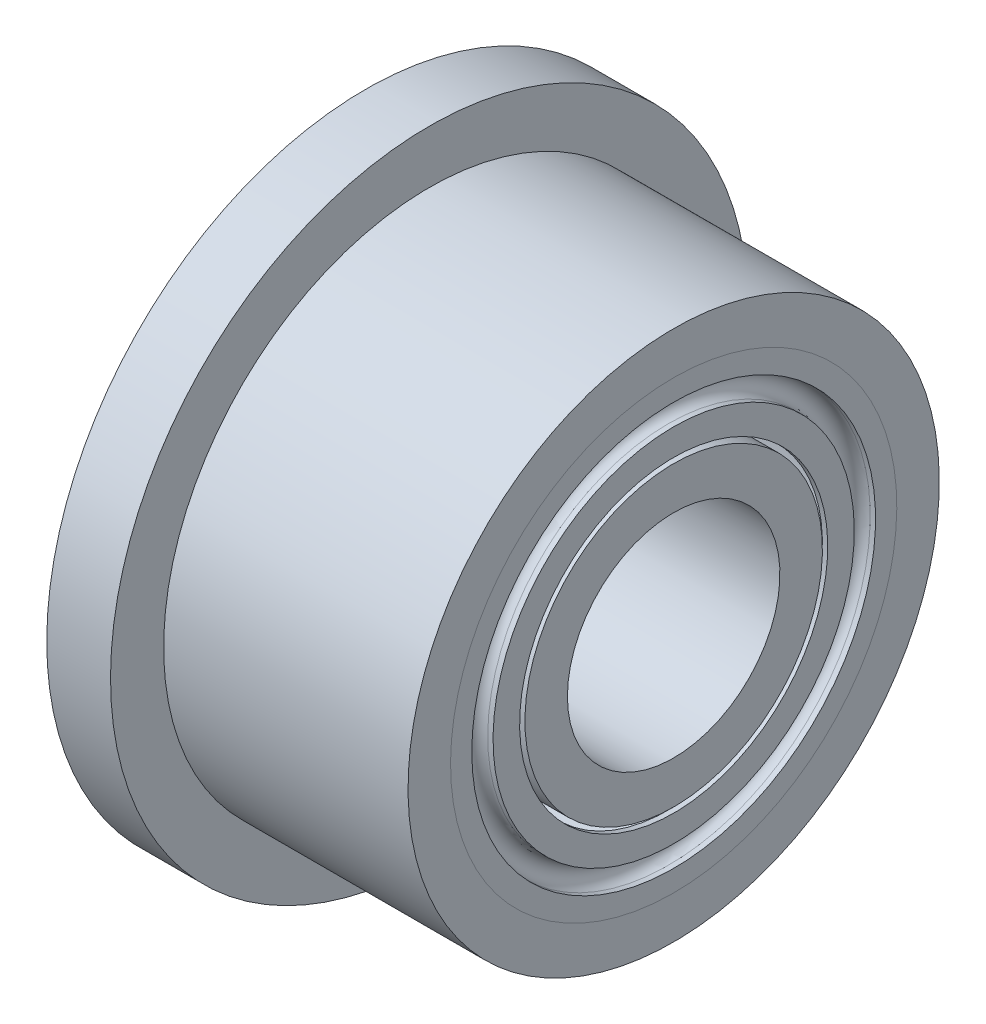
ISO-10303-21;
HEADER;
FILE_DESCRIPTION(('STEP AP214'),'2;1');
FILE_NAME('part.step','',(''),(''),'','','');
FILE_SCHEMA(('AUTOMOTIVE_DESIGN { 1 0 10303 214 1 1 1 1 }'));
ENDSEC;
DATA;
#1=APPLICATION_CONTEXT('core data for automotive mechanical design processes');
#2=APPLICATION_PROTOCOL_DEFINITION('international standard','automotive_design',2000,#1);
#3=PRODUCT_CONTEXT('',#1,'mechanical');
#4=PRODUCT('Part','Part','',(#3));
#5=PRODUCT_RELATED_PRODUCT_CATEGORY('part','',(#4));
#6=PRODUCT_DEFINITION_FORMATION('','',#4);
#7=PRODUCT_DEFINITION_CONTEXT('part definition',#1,'design');
#8=PRODUCT_DEFINITION('design','',#6,#7);
#9=PRODUCT_DEFINITION_SHAPE('','',#8);
#10=(LENGTH_UNIT() NAMED_UNIT(*) SI_UNIT(.MILLI.,.METRE.));
#11=(NAMED_UNIT(*) PLANE_ANGLE_UNIT() SI_UNIT($,.RADIAN.));
#12=(NAMED_UNIT(*) SI_UNIT($,.STERADIAN.) SOLID_ANGLE_UNIT());
#13=UNCERTAINTY_MEASURE_WITH_UNIT(LENGTH_MEASURE(1.E-05),#10,'distance_accuracy_value','');
#14=(GEOMETRIC_REPRESENTATION_CONTEXT(3) GLOBAL_UNCERTAINTY_ASSIGNED_CONTEXT((#13)) GLOBAL_UNIT_ASSIGNED_CONTEXT((#10,
#11,#12)) REPRESENTATION_CONTEXT('',''));
#15=CARTESIAN_POINT('',(0.,0.,0.));
#16=DIRECTION('',(0.,0.,1.));
#17=DIRECTION('',(1.,0.,0.));
#18=AXIS2_PLACEMENT_3D('',#15,#16,#17);
#19=CARTESIAN_POINT('',(6.,42.9,120.969863647503));
#20=DIRECTION('',(1.,0.,0.));
#21=DIRECTION('',(0.,-0.948451293798745,-0.316922929576715));
#22=AXIS2_PLACEMENT_3D('',#19,#20,#21);
#23=CYLINDRICAL_SURFACE('',#22,1.4);
#24=CARTESIAN_POINT('',(6.,42.9,120.969863647503));
#25=DIRECTION('',(1.,0.,0.));
#26=DIRECTION('',(0.,-0.948451293798745,-0.316922929576715));
#27=AXIS2_PLACEMENT_3D('',#24,#25,#26);
#28=CIRCLE('',#27,1.4);
#29=CARTESIAN_POINT('',(6.,41.5721681886818,120.526171546096));
#30=VERTEX_POINT('',#29);
#31=EDGE_CURVE('P0_E11',#30,#30,#28,.T.);
#32=ORIENTED_EDGE('',*,*,#31,.T.);
#33=EDGE_LOOP('',(#32));
#34=FACE_BOUND('',#33,.T.);
#35=CARTESIAN_POINT('',(8.9,42.9,120.969863647503));
#36=DIRECTION('',(1.,0.,0.));
#37=DIRECTION('',(0.,-0.948451293798745,-0.316922929576715));
#38=AXIS2_PLACEMENT_3D('',#35,#36,#37);
#39=CIRCLE('',#38,1.4);
#40=CARTESIAN_POINT('',(8.9,41.5721681886818,120.526171546096));
#41=VERTEX_POINT('',#40);
#42=EDGE_CURVE('P0_E49',#41,#41,#39,.T.);
#43=ORIENTED_EDGE('',*,*,#42,.F.);
#44=EDGE_LOOP('',(#43));
#45=FACE_BOUND('',#44,.T.);
#46=ADVANCED_FACE('P0_F16',(#34,#45),#23,.T.);
#47=CARTESIAN_POINT('',(6.,42.9,120.969863647503));
#48=DIRECTION('',(1.,0.,0.));
#49=DIRECTION('',(0.,-0.948451293798745,-0.316922929576715));
#50=AXIS2_PLACEMENT_3D('',#47,#48,#49);
#51=PLANE('',#50);
#52=CARTESIAN_POINT('',(6.,42.9,120.969863647503));
#53=DIRECTION('',(1.,0.,0.));
#54=DIRECTION('',(0.,-0.948451293798745,-0.316922929576715));
#55=AXIS2_PLACEMENT_3D('',#52,#53,#54);
#56=CIRCLE('',#55,1.);
#57=CARTESIAN_POINT('',(6.,41.9515487062013,120.652940717926));
#58=VERTEX_POINT('',#57);
#59=EDGE_CURVE('P0_E25',#58,#58,#56,.T.);
#60=ORIENTED_EDGE('',*,*,#59,.T.);
#61=EDGE_LOOP('',(#60));
#62=FACE_BOUND('',#61,.T.);
#63=ORIENTED_EDGE('',*,*,#31,.F.);
#64=EDGE_LOOP('',(#63));
#65=FACE_BOUND('',#64,.T.);
#66=ADVANCED_FACE('P0_F69',(#62,#65),#51,.F.);
#67=CARTESIAN_POINT('',(8.9,42.9,120.969863647503));
#68=DIRECTION('',(-1.,0.,0.));
#69=DIRECTION('',(0.,0.948451293798745,0.316922929576715));
#70=AXIS2_PLACEMENT_3D('',#67,#68,#69);
#71=CYLINDRICAL_SURFACE('',#70,1.);
#72=CARTESIAN_POINT('',(8.9,42.9,120.969863647503));
#73=DIRECTION('',(1.,0.,0.));
#74=DIRECTION('',(0.,-0.948451293798745,-0.316922929576715));
#75=AXIS2_PLACEMENT_3D('',#72,#73,#74);
#76=CIRCLE('',#75,1.);
#77=CARTESIAN_POINT('',(8.9,41.9515487062013,120.652940717926));
#78=VERTEX_POINT('',#77);
#79=EDGE_CURVE('P0_E19',#78,#78,#76,.T.);
#80=ORIENTED_EDGE('',*,*,#79,.T.);
#81=EDGE_LOOP('',(#80));
#82=FACE_BOUND('',#81,.T.);
#83=ORIENTED_EDGE('',*,*,#59,.F.);
#84=EDGE_LOOP('',(#83));
#85=FACE_BOUND('',#84,.T.);
#86=ADVANCED_FACE('P0_F64',(#82,#85),#71,.F.);
#87=CARTESIAN_POINT('',(8.9,42.9,120.969863647503));
#88=DIRECTION('',(1.,0.,0.));
#89=DIRECTION('',(0.,-0.948451293798745,-0.316922929576715));
#90=AXIS2_PLACEMENT_3D('',#87,#88,#89);
#91=PLANE('',#90);
#92=ORIENTED_EDGE('',*,*,#79,.F.);
#93=EDGE_LOOP('',(#92));
#94=FACE_BOUND('',#93,.T.);
#95=ORIENTED_EDGE('',*,*,#42,.T.);
#96=EDGE_LOOP('',(#95));
#97=FACE_BOUND('',#96,.T.);
#98=ADVANCED_FACE('P0_F50',(#94,#97),#91,.T.);
#99=CLOSED_SHELL('',(#46,#66,#86,#98));
#100=MANIFOLD_SOLID_BREP('P0_B1',#99);
#101=CARTESIAN_POINT('',(8.85,42.9,120.969863647503));
#102=DIRECTION('',(1.,0.,0.));
#103=DIRECTION('',(0.,-0.948451293798745,-0.316922929576715));
#104=AXIS2_PLACEMENT_3D('',#101,#102,#103);
#105=TOROIDAL_SURFACE('',#104,1.8,0.1);
#106=CARTESIAN_POINT('',(8.85,42.9,120.969863647503));
#107=DIRECTION('',(1.,0.,0.));
#108=DIRECTION('',(0.,-0.948451293798745,-0.316922929576715));
#109=AXIS2_PLACEMENT_3D('',#106,#107,#108);
#110=CIRCLE('',#109,1.7);
#111=CARTESIAN_POINT('',(8.85,41.2876328005421,120.431094667223));
#112=VERTEX_POINT('',#111);
#113=EDGE_CURVE('P1_E11',#112,#112,#110,.T.);
#114=ORIENTED_EDGE('',*,*,#113,.F.);
#115=EDGE_LOOP('',(#114));
#116=FACE_BOUND('',#115,.T.);
#117=CARTESIAN_POINT('',(8.85,42.9,120.969863647503));
#118=DIRECTION('',(1.,0.,0.));
#119=DIRECTION('',(0.,-0.948451293798745,-0.316922929576715));
#120=AXIS2_PLACEMENT_3D('',#117,#118,#119);
#121=CIRCLE('',#120,1.9);
#122=CARTESIAN_POINT('',(8.85,41.0979425417824,120.367710081307));
#123=VERTEX_POINT('',#122);
#124=EDGE_CURVE('P1_E83',#123,#123,#121,.T.);
#125=ORIENTED_EDGE('',*,*,#124,.T.);
#126=EDGE_LOOP('',(#125));
#127=FACE_BOUND('',#126,.T.);
#128=ADVANCED_FACE('P1_F16',(#116,#127),#105,.F.);
#129=CARTESIAN_POINT('',(7.45,42.9,120.969863647503));
#130=DIRECTION('',(1.,0.,0.));
#131=DIRECTION('',(0.,-0.948451293798745,-0.316922929576715));
#132=AXIS2_PLACEMENT_3D('',#129,#130,#131);
#133=CYLINDRICAL_SURFACE('',#132,1.7);
#134=CARTESIAN_POINT('',(8.9,42.9,120.969863647503));
#135=DIRECTION('',(1.,0.,0.));
#136=DIRECTION('',(0.,-0.948451293798745,-0.316922929576715));
#137=AXIS2_PLACEMENT_3D('',#134,#135,#136);
#138=CIRCLE('',#137,1.7);
#139=CARTESIAN_POINT('',(8.9,41.2876328005421,120.431094667223));
#140=VERTEX_POINT('',#139);
#141=EDGE_CURVE('P1_E27',#140,#140,#138,.T.);
#142=ORIENTED_EDGE('',*,*,#141,.F.);
#143=EDGE_LOOP('',(#142));
#144=FACE_BOUND('',#143,.T.);
#145=ORIENTED_EDGE('',*,*,#113,.T.);
#146=EDGE_LOOP('',(#145));
#147=FACE_BOUND('',#146,.T.);
#148=ADVANCED_FACE('P1_F120',(#144,#147),#133,.T.);
#149=CARTESIAN_POINT('',(8.9,44.5123671994579,121.508632627783));
#150=DIRECTION('',(-1.,0.,0.));
#151=DIRECTION('',(0.,-0.316922929576715,0.948451293798745));
#152=AXIS2_PLACEMENT_3D('',#149,#150,#151);
#153=PLANE('',#152);
#154=CARTESIAN_POINT('',(8.9,42.9,120.969863647503));
#155=DIRECTION('',(1.,0.,0.));
#156=DIRECTION('',(0.,-0.948451293798745,-0.316922929576715));
#157=AXIS2_PLACEMENT_3D('',#154,#155,#156);
#158=CIRCLE('',#157,1.45);
#159=CARTESIAN_POINT('',(8.9,41.5247456239918,120.510325399617));
#160=VERTEX_POINT('',#159);
#161=EDGE_CURVE('P1_E93',#160,#160,#158,.T.);
#162=ORIENTED_EDGE('',*,*,#161,.F.);
#163=EDGE_LOOP('',(#162));
#164=FACE_BOUND('',#163,.T.);
#165=ORIENTED_EDGE('',*,*,#141,.T.);
#166=EDGE_LOOP('',(#165));
#167=FACE_BOUND('',#166,.T.);
#168=ADVANCED_FACE('P1_F126',(#164,#167),#153,.F.);
#169=CARTESIAN_POINT('',(7.45,42.9,120.969863647503));
#170=DIRECTION('',(1.,0.,0.));
#171=DIRECTION('',(0.,-0.948451293798745,-0.316922929576715));
#172=AXIS2_PLACEMENT_3D('',#169,#170,#171);
#173=CYLINDRICAL_SURFACE('',#172,1.45);
#174=CARTESIAN_POINT('',(8.85,42.9,120.969863647503));
#175=DIRECTION('',(1.,0.,0.));
#176=DIRECTION('',(0.,-0.948451293798745,-0.316922929576715));
#177=AXIS2_PLACEMENT_3D('',#174,#175,#176);
#178=CIRCLE('',#177,1.45);
#179=CARTESIAN_POINT('',(8.85,41.5247456239918,120.510325399617));
#180=VERTEX_POINT('',#179);
#181=EDGE_CURVE('P1_E95',#180,#180,#178,.T.);
#182=ORIENTED_EDGE('',*,*,#181,.F.);
#183=EDGE_LOOP('',(#182));
#184=FACE_BOUND('',#183,.T.);
#185=ORIENTED_EDGE('',*,*,#161,.T.);
#186=EDGE_LOOP('',(#185));
#187=FACE_BOUND('',#186,.T.);
#188=ADVANCED_FACE('P1_F134',(#184,#187),#173,.F.);
#189=CARTESIAN_POINT('',(8.85,44.4649446347679,121.492786481305));
#190=DIRECTION('',(1.,0.,0.));
#191=DIRECTION('',(0.,-0.948451293798745,-0.316922929576715));
#192=AXIS2_PLACEMENT_3D('',#189,#190,#191);
#193=PLANE('',#192);
#194=ORIENTED_EDGE('',*,*,#181,.T.);
#195=EDGE_LOOP('',(#194));
#196=FACE_BOUND('',#195,.T.);
#197=CARTESIAN_POINT('',(8.85,42.9,120.969863647503));
#198=DIRECTION('',(1.,0.,0.));
#199=DIRECTION('',(0.,-0.948451293798745,-0.316922929576715));
#200=AXIS2_PLACEMENT_3D('',#197,#198,#199);
#201=CIRCLE('',#200,1.65);
#202=CARTESIAN_POINT('',(8.85,41.3350553652321,120.446940813701));
#203=VERTEX_POINT('',#202);
#204=EDGE_CURVE('P1_E80',#203,#203,#201,.T.);
#205=ORIENTED_EDGE('',*,*,#204,.F.);
#206=EDGE_LOOP('',(#205));
#207=FACE_BOUND('',#206,.T.);
#208=ADVANCED_FACE('P1_F131',(#196,#207),#193,.F.);
#209=CARTESIAN_POINT('',(8.85,42.9,120.969863647503));
#210=DIRECTION('',(1.,0.,0.));
#211=DIRECTION('',(0.,-0.948451293798745,-0.316922929576715));
#212=AXIS2_PLACEMENT_3D('',#209,#210,#211);
#213=TOROIDAL_SURFACE('',#212,1.8,0.15);
#214=CARTESIAN_POINT('',(8.85,42.9,120.969863647503));
#215=DIRECTION('',(1.,0.,0.));
#216=DIRECTION('',(0.,-0.948451293798745,-0.316922929576715));
#217=AXIS2_PLACEMENT_3D('',#214,#215,#216);
#218=CIRCLE('',#217,1.95);
#219=CARTESIAN_POINT('',(8.85,41.0505199770924,120.351863934828));
#220=VERTEX_POINT('',#219);
#221=EDGE_CURVE('P1_E74',#220,#220,#218,.T.);
#222=ORIENTED_EDGE('',*,*,#221,.F.);
#223=EDGE_LOOP('',(#222));
#224=FACE_BOUND('',#223,.T.);
#225=ORIENTED_EDGE('',*,*,#204,.T.);
#226=EDGE_LOOP('',(#225));
#227=FACE_BOUND('',#226,.T.);
#228=ADVANCED_FACE('P1_F18',(#224,#227),#213,.T.);
#229=CARTESIAN_POINT('',(8.85,44.7494800229076,121.587863360178));
#230=DIRECTION('',(1.,0.,0.));
#231=DIRECTION('',(0.,-0.948451293798745,-0.316922929576715));
#232=AXIS2_PLACEMENT_3D('',#229,#230,#231);
#233=PLANE('',#232);
#234=ORIENTED_EDGE('',*,*,#221,.T.);
#235=EDGE_LOOP('',(#234));
#236=FACE_BOUND('',#235,.T.);
#237=CARTESIAN_POINT('',(8.85,42.9,120.969863647503));
#238=DIRECTION('',(1.,0.,0.));
#239=DIRECTION('',(0.,-0.948451293798745,-0.316922929576715));
#240=AXIS2_PLACEMENT_3D('',#237,#238,#239);
#241=CIRCLE('',#240,2.1);
#242=CARTESIAN_POINT('',(8.85,40.9082522830226,120.304325495392));
#243=VERTEX_POINT('',#242);
#244=EDGE_CURVE('P1_E20',#243,#243,#241,.T.);
#245=ORIENTED_EDGE('',*,*,#244,.F.);
#246=EDGE_LOOP('',(#245));
#247=FACE_BOUND('',#246,.T.);
#248=ADVANCED_FACE('P1_F116',(#236,#247),#233,.F.);
#249=CARTESIAN_POINT('',(7.45,42.9,120.969863647503));
#250=DIRECTION('',(1.,0.,0.));
#251=DIRECTION('',(0.,-0.948451293798745,-0.316922929576715));
#252=AXIS2_PLACEMENT_3D('',#249,#250,#251);
#253=CYLINDRICAL_SURFACE('',#252,2.1);
#254=CARTESIAN_POINT('',(8.9,42.9,120.969863647503));
#255=DIRECTION('',(1.,0.,0.));
#256=DIRECTION('',(0.,-0.948451293798745,-0.316922929576715));
#257=AXIS2_PLACEMENT_3D('',#254,#255,#256);
#258=CIRCLE('',#257,2.1);
#259=CARTESIAN_POINT('',(8.9,40.9082522830226,120.304325495392));
#260=VERTEX_POINT('',#259);
#261=EDGE_CURVE('P1_E75',#260,#260,#258,.T.);
#262=ORIENTED_EDGE('',*,*,#261,.F.);
#263=EDGE_LOOP('',(#262));
#264=FACE_BOUND('',#263,.T.);
#265=ORIENTED_EDGE('',*,*,#244,.T.);
#266=EDGE_LOOP('',(#265));
#267=FACE_BOUND('',#266,.T.);
#268=ADVANCED_FACE('P1_F71',(#264,#267),#253,.T.);
#269=CARTESIAN_POINT('',(8.9,44.7020574582176,121.572017213699));
#270=DIRECTION('',(-1.,0.,0.));
#271=DIRECTION('',(0.,-0.316922929576715,0.948451293798745));
#272=AXIS2_PLACEMENT_3D('',#269,#270,#271);
#273=PLANE('',#272);
#274=CARTESIAN_POINT('',(8.9,42.9,120.969863647503));
#275=DIRECTION('',(1.,0.,0.));
#276=DIRECTION('',(0.,-0.948451293798745,-0.316922929576715));
#277=AXIS2_PLACEMENT_3D('',#274,#275,#276);
#278=CIRCLE('',#277,1.9);
#279=CARTESIAN_POINT('',(8.9,41.0979425417824,120.367710081307));
#280=VERTEX_POINT('',#279);
#281=EDGE_CURVE('P1_E90',#280,#280,#278,.T.);
#282=ORIENTED_EDGE('',*,*,#281,.F.);
#283=EDGE_LOOP('',(#282));
#284=FACE_BOUND('',#283,.T.);
#285=ORIENTED_EDGE('',*,*,#261,.T.);
#286=EDGE_LOOP('',(#285));
#287=FACE_BOUND('',#286,.T.);
#288=ADVANCED_FACE('P1_F107',(#284,#287),#273,.F.);
#289=CARTESIAN_POINT('',(7.45,42.9,120.969863647503));
#290=DIRECTION('',(1.,0.,0.));
#291=DIRECTION('',(0.,-0.948451293798745,-0.316922929576715));
#292=AXIS2_PLACEMENT_3D('',#289,#290,#291);
#293=CYLINDRICAL_SURFACE('',#292,1.9);
#294=ORIENTED_EDGE('',*,*,#124,.F.);
#295=EDGE_LOOP('',(#294));
#296=FACE_BOUND('',#295,.T.);
#297=ORIENTED_EDGE('',*,*,#281,.T.);
#298=EDGE_LOOP('',(#297));
#299=FACE_BOUND('',#298,.T.);
#300=ADVANCED_FACE('P1_F105',(#296,#299),#293,.F.);
#301=CLOSED_SHELL('',(#128,#148,#168,#188,#208,#228,#248,#268,#288,#300));
#302=MANIFOLD_SOLID_BREP('P1_B1',#301);
#303=CARTESIAN_POINT('',(7.45,42.9,120.969863647503));
#304=DIRECTION('',(1.,0.,0.));
#305=DIRECTION('',(0.,-0.948451293798745,-0.316922929576715));
#306=AXIS2_PLACEMENT_3D('',#303,#304,#305);
#307=CYLINDRICAL_SURFACE('',#306,1.9);
#308=CARTESIAN_POINT('',(6.,42.9,120.969863647503));
#309=DIRECTION('',(1.,0.,0.));
#310=DIRECTION('',(0.,-0.948451293798745,-0.316922929576715));
#311=AXIS2_PLACEMENT_3D('',#308,#309,#310);
#312=CIRCLE('',#311,1.9);
#313=CARTESIAN_POINT('',(6.,41.0979425417824,120.367710081307));
#314=VERTEX_POINT('',#313);
#315=EDGE_CURVE('P2_E101',#314,#314,#312,.T.);
#316=ORIENTED_EDGE('',*,*,#315,.F.);
#317=EDGE_LOOP('',(#316));
#318=FACE_BOUND('',#317,.T.);
#319=CARTESIAN_POINT('',(6.05,42.9,120.969863647503));
#320=DIRECTION('',(1.,0.,0.));
#321=DIRECTION('',(0.,-0.948451293798745,-0.316922929576715));
#322=AXIS2_PLACEMENT_3D('',#319,#320,#321);
#323=CIRCLE('',#322,1.9);
#324=CARTESIAN_POINT('',(6.05,41.0979425417824,120.367710081307));
#325=VERTEX_POINT('',#324);
#326=EDGE_CURVE('P2_E11',#325,#325,#323,.T.);
#327=ORIENTED_EDGE('',*,*,#326,.T.);
#328=EDGE_LOOP('',(#327));
#329=FACE_BOUND('',#328,.T.);
#330=ADVANCED_FACE('P2_F16',(#318,#329),#307,.F.);
#331=CARTESIAN_POINT('',(6.05,42.9,120.969863647503));
#332=DIRECTION('',(1.,0.,0.));
#333=DIRECTION('',(0.,-0.948451293798745,-0.316922929576715));
#334=AXIS2_PLACEMENT_3D('',#331,#332,#333);
#335=TOROIDAL_SURFACE('',#334,1.8,0.1);
#336=ORIENTED_EDGE('',*,*,#326,.F.);
#337=EDGE_LOOP('',(#336));
#338=FACE_BOUND('',#337,.T.);
#339=CARTESIAN_POINT('',(6.05,42.9,120.969863647503));
#340=DIRECTION('',(1.,0.,0.));
#341=DIRECTION('',(0.,-0.948451293798745,-0.316922929576715));
#342=AXIS2_PLACEMENT_3D('',#339,#340,#341);
#343=CIRCLE('',#342,1.7);
#344=CARTESIAN_POINT('',(6.05,41.2876328005421,120.431094667223));
#345=VERTEX_POINT('',#344);
#346=EDGE_CURVE('P2_E27',#345,#345,#343,.T.);
#347=ORIENTED_EDGE('',*,*,#346,.T.);
#348=EDGE_LOOP('',(#347));
#349=FACE_BOUND('',#348,.T.);
#350=ADVANCED_FACE('P2_F162',(#338,#349),#335,.F.);
#351=CARTESIAN_POINT('',(7.45,42.9,120.969863647503));
#352=DIRECTION('',(1.,0.,0.));
#353=DIRECTION('',(0.,-0.948451293798745,-0.316922929576715));
#354=AXIS2_PLACEMENT_3D('',#351,#352,#353);
#355=CYLINDRICAL_SURFACE('',#354,1.7);
#356=ORIENTED_EDGE('',*,*,#346,.F.);
#357=EDGE_LOOP('',(#356));
#358=FACE_BOUND('',#357,.T.);
#359=CARTESIAN_POINT('',(6.,42.9,120.969863647503));
#360=DIRECTION('',(1.,0.,0.));
#361=DIRECTION('',(0.,-0.948451293798745,-0.316922929576715));
#362=AXIS2_PLACEMENT_3D('',#359,#360,#361);
#363=CIRCLE('',#362,1.7);
#364=CARTESIAN_POINT('',(6.,41.2876328005421,120.431094667223));
#365=VERTEX_POINT('',#364);
#366=EDGE_CURVE('P2_E107',#365,#365,#363,.T.);
#367=ORIENTED_EDGE('',*,*,#366,.T.);
#368=EDGE_LOOP('',(#367));
#369=FACE_BOUND('',#368,.T.);
#370=ADVANCED_FACE('P2_F168',(#358,#369),#355,.T.);
#371=CARTESIAN_POINT('',(6.,44.5123671994579,121.508632627783));
#372=DIRECTION('',(1.,0.,0.));
#373=DIRECTION('',(0.,-0.948451293798745,-0.316922929576715));
#374=AXIS2_PLACEMENT_3D('',#371,#372,#373);
#375=PLANE('',#374);
#376=CARTESIAN_POINT('',(6.,42.9,120.969863647503));
#377=DIRECTION('',(1.,0.,0.));
#378=DIRECTION('',(0.,-0.948451293798745,-0.316922929576715));
#379=AXIS2_PLACEMENT_3D('',#376,#377,#378);
#380=CIRCLE('',#379,1.45);
#381=CARTESIAN_POINT('',(6.,41.5247456239918,120.510325399617));
#382=VERTEX_POINT('',#381);
#383=EDGE_CURVE('P2_E109',#382,#382,#380,.T.);
#384=ORIENTED_EDGE('',*,*,#383,.T.);
#385=EDGE_LOOP('',(#384));
#386=FACE_BOUND('',#385,.T.);
#387=ORIENTED_EDGE('',*,*,#366,.F.);
#388=EDGE_LOOP('',(#387));
#389=FACE_BOUND('',#388,.T.);
#390=ADVANCED_FACE('P2_F179',(#386,#389),#375,.F.);
#391=CARTESIAN_POINT('',(7.45,42.9,120.969863647503));
#392=DIRECTION('',(1.,0.,0.));
#393=DIRECTION('',(0.,-0.948451293798745,-0.316922929576715));
#394=AXIS2_PLACEMENT_3D('',#391,#392,#393);
#395=CYLINDRICAL_SURFACE('',#394,1.45);
#396=ORIENTED_EDGE('',*,*,#383,.F.);
#397=EDGE_LOOP('',(#396));
#398=FACE_BOUND('',#397,.T.);
#399=CARTESIAN_POINT('',(6.05,42.9,120.969863647503));
#400=DIRECTION('',(1.,0.,0.));
#401=DIRECTION('',(0.,-0.948451293798745,-0.316922929576715));
#402=AXIS2_PLACEMENT_3D('',#399,#400,#401);
#403=CIRCLE('',#402,1.45);
#404=CARTESIAN_POINT('',(6.05,41.5247456239918,120.510325399617));
#405=VERTEX_POINT('',#404);
#406=EDGE_CURVE('P2_E98',#405,#405,#403,.T.);
#407=ORIENTED_EDGE('',*,*,#406,.T.);
#408=EDGE_LOOP('',(#407));
#409=FACE_BOUND('',#408,.T.);
#410=ADVANCED_FACE('P2_F18',(#398,#409),#395,.F.);
#411=CARTESIAN_POINT('',(6.05,44.4649446347679,121.492786481305));
#412=DIRECTION('',(-1.,0.,0.));
#413=DIRECTION('',(0.,-0.316922929576715,0.948451293798745));
#414=AXIS2_PLACEMENT_3D('',#411,#412,#413);
#415=PLANE('',#414);
#416=ORIENTED_EDGE('',*,*,#406,.F.);
#417=EDGE_LOOP('',(#416));
#418=FACE_BOUND('',#417,.T.);
#419=CARTESIAN_POINT('',(6.05,42.9,120.969863647503));
#420=DIRECTION('',(1.,0.,0.));
#421=DIRECTION('',(0.,-0.948451293798745,-0.316922929576715));
#422=AXIS2_PLACEMENT_3D('',#419,#420,#421);
#423=CIRCLE('',#422,1.65);
#424=CARTESIAN_POINT('',(6.05,41.3350553652321,120.446940813701));
#425=VERTEX_POINT('',#424);
#426=EDGE_CURVE('P2_E82',#425,#425,#423,.T.);
#427=ORIENTED_EDGE('',*,*,#426,.T.);
#428=EDGE_LOOP('',(#427));
#429=FACE_BOUND('',#428,.T.);
#430=ADVANCED_FACE('P2_F173',(#418,#429),#415,.F.);
#431=CARTESIAN_POINT('',(6.05,42.9,120.969863647503));
#432=DIRECTION('',(1.,0.,0.));
#433=DIRECTION('',(0.,-0.948451293798745,-0.316922929576715));
#434=AXIS2_PLACEMENT_3D('',#431,#432,#433);
#435=TOROIDAL_SURFACE('',#434,1.8,0.15);
#436=ORIENTED_EDGE('',*,*,#426,.F.);
#437=EDGE_LOOP('',(#436));
#438=FACE_BOUND('',#437,.T.);
#439=CARTESIAN_POINT('',(6.05,42.9,120.969863647503));
#440=DIRECTION('',(1.,0.,0.));
#441=DIRECTION('',(0.,-0.948451293798745,-0.316922929576715));
#442=AXIS2_PLACEMENT_3D('',#439,#440,#441);
#443=CIRCLE('',#442,1.95);
#444=CARTESIAN_POINT('',(6.05,41.0505199770924,120.351863934828));
#445=VERTEX_POINT('',#444);
#446=EDGE_CURVE('P2_E88',#445,#445,#443,.T.);
#447=ORIENTED_EDGE('',*,*,#446,.T.);
#448=EDGE_LOOP('',(#447));
#449=FACE_BOUND('',#448,.T.);
#450=ADVANCED_FACE('P2_F89',(#438,#449),#435,.T.);
#451=CARTESIAN_POINT('',(6.05,44.7494800229076,121.587863360178));
#452=DIRECTION('',(-1.,0.,0.));
#453=DIRECTION('',(0.,-0.316922929576715,0.948451293798745));
#454=AXIS2_PLACEMENT_3D('',#451,#452,#453);
#455=PLANE('',#454);
#456=ORIENTED_EDGE('',*,*,#446,.F.);
#457=EDGE_LOOP('',(#456));
#458=FACE_BOUND('',#457,.T.);
#459=CARTESIAN_POINT('',(6.05,42.9,120.969863647503));
#460=DIRECTION('',(1.,0.,0.));
#461=DIRECTION('',(0.,0.948451293798745,0.316922929576715));
#462=AXIS2_PLACEMENT_3D('',#459,#460,#461);
#463=CIRCLE('',#462,2.1);
#464=CARTESIAN_POINT('',(6.05,44.8917477169774,121.635401799614));
#465=VERTEX_POINT('',#464);
#466=EDGE_CURVE('P2_E118',#465,#465,#463,.T.);
#467=ORIENTED_EDGE('',*,*,#466,.T.);
#468=EDGE_LOOP('',(#467));
#469=FACE_BOUND('',#468,.T.);
#470=ADVANCED_FACE('P2_F158',(#458,#469),#455,.F.);
#471=CARTESIAN_POINT('',(6.6,42.9,120.969863647503));
#472=DIRECTION('',(-1.,0.,0.));
#473=DIRECTION('',(0.,-0.316922929576715,0.948451293798745));
#474=AXIS2_PLACEMENT_3D('',#471,#472,#473);
#475=PLANE('',#474);
#476=CARTESIAN_POINT('',(6.6,42.9,120.969863647503));
#477=DIRECTION('',(-1.,0.,0.));
#478=DIRECTION('',(0.,0.948451293798745,0.316922929576715));
#479=AXIS2_PLACEMENT_3D('',#476,#477,#478);
#480=CIRCLE('',#479,2.5);
#481=CARTESIAN_POINT('',(6.6,45.2711282344969,121.762170971445));
#482=VERTEX_POINT('',#481);
#483=EDGE_CURVE('P2_E125',#482,#482,#480,.T.);
#484=ORIENTED_EDGE('',*,*,#483,.T.);
#485=EDGE_LOOP('',(#484));
#486=FACE_BOUND('',#485,.T.);
#487=CARTESIAN_POINT('',(6.6,42.9,120.969863647503));
#488=DIRECTION('',(-1.,0.,0.));
#489=DIRECTION('',(0.,0.948451293798745,0.316922929576715));
#490=AXIS2_PLACEMENT_3D('',#487,#488,#489);
#491=CIRCLE('',#490,3.);
#492=CARTESIAN_POINT('',(6.6,45.7453538813962,121.920632436233));
#493=VERTEX_POINT('',#492);
#494=EDGE_CURVE('P2_E92',#493,#493,#491,.T.);
#495=ORIENTED_EDGE('',*,*,#494,.F.);
#496=EDGE_LOOP('',(#495));
#497=FACE_BOUND('',#496,.T.);
#498=ADVANCED_FACE('P2_F147',(#486,#497),#475,.F.);
#499=CARTESIAN_POINT('',(6.6,42.9,120.969863647503));
#500=DIRECTION('',(-1.,0.,0.));
#501=DIRECTION('',(0.,0.948451293798745,0.316922929576715));
#502=AXIS2_PLACEMENT_3D('',#499,#500,#501);
#503=CYLINDRICAL_SURFACE('',#502,3.);
#504=ORIENTED_EDGE('',*,*,#494,.T.);
#505=EDGE_LOOP('',(#504));
#506=FACE_BOUND('',#505,.T.);
#507=CARTESIAN_POINT('',(6.,42.9,120.969863647503));
#508=DIRECTION('',(-1.,0.,0.));
#509=DIRECTION('',(0.,0.948451293798745,0.316922929576715));
#510=AXIS2_PLACEMENT_3D('',#507,#508,#509);
#511=CIRCLE('',#510,3.);
#512=CARTESIAN_POINT('',(6.,45.7453538813962,121.920632436233));
#513=VERTEX_POINT('',#512);
#514=EDGE_CURVE('P2_E20',#513,#513,#511,.T.);
#515=ORIENTED_EDGE('',*,*,#514,.F.);
#516=EDGE_LOOP('',(#515));
#517=FACE_BOUND('',#516,.T.);
#518=ADVANCED_FACE('P2_F145',(#506,#517),#503,.T.);
#519=CARTESIAN_POINT('',(6.,42.9,120.969863647503));
#520=DIRECTION('',(1.,0.,0.));
#521=DIRECTION('',(0.,-0.948451293798745,-0.316922929576715));
#522=AXIS2_PLACEMENT_3D('',#519,#520,#521);
#523=PLANE('',#522);
#524=ORIENTED_EDGE('',*,*,#315,.T.);
#525=EDGE_LOOP('',(#524));
#526=FACE_BOUND('',#525,.T.);
#527=ORIENTED_EDGE('',*,*,#514,.T.);
#528=EDGE_LOOP('',(#527));
#529=FACE_BOUND('',#528,.T.);
#530=ADVANCED_FACE('P2_F143',(#526,#529),#523,.F.);
#531=CARTESIAN_POINT('',(8.9,42.9,120.969863647503));
#532=DIRECTION('',(1.,0.,0.));
#533=DIRECTION('',(0.,-0.948451293798745,-0.316922929576715));
#534=AXIS2_PLACEMENT_3D('',#531,#532,#533);
#535=PLANE('',#534);
#536=CARTESIAN_POINT('',(8.9,42.9,120.969863647503));
#537=DIRECTION('',(1.,0.,0.));
#538=DIRECTION('',(0.,-0.948451293798745,-0.316922929576715));
#539=AXIS2_PLACEMENT_3D('',#536,#537,#538);
#540=CIRCLE('',#539,2.1);
#541=CARTESIAN_POINT('',(8.9,40.9082522830226,120.304325495392));
#542=VERTEX_POINT('',#541);
#543=EDGE_CURVE('P2_E120',#542,#542,#540,.T.);
#544=ORIENTED_EDGE('',*,*,#543,.F.);
#545=EDGE_LOOP('',(#544));
#546=FACE_BOUND('',#545,.T.);
#547=CARTESIAN_POINT('',(8.9,42.9,120.969863647503));
#548=DIRECTION('',(1.,0.,0.));
#549=DIRECTION('',(0.,-0.948451293798745,-0.316922929576715));
#550=AXIS2_PLACEMENT_3D('',#547,#548,#549);
#551=CIRCLE('',#550,2.5);
#552=CARTESIAN_POINT('',(8.9,40.5288717655031,120.177556323561));
#553=VERTEX_POINT('',#552);
#554=EDGE_CURVE('P2_E105',#553,#553,#551,.T.);
#555=ORIENTED_EDGE('',*,*,#554,.T.);
#556=EDGE_LOOP('',(#555));
#557=FACE_BOUND('',#556,.T.);
#558=ADVANCED_FACE('P2_F155',(#546,#557),#535,.T.);
#559=CARTESIAN_POINT('',(8.9,42.9,120.969863647503));
#560=DIRECTION('',(-1.,0.,0.));
#561=DIRECTION('',(0.,0.948451293798745,0.316922929576715));
#562=AXIS2_PLACEMENT_3D('',#559,#560,#561);
#563=CYLINDRICAL_SURFACE('',#562,2.5);
#564=ORIENTED_EDGE('',*,*,#554,.F.);
#565=EDGE_LOOP('',(#564));
#566=FACE_BOUND('',#565,.T.);
#567=ORIENTED_EDGE('',*,*,#483,.F.);
#568=EDGE_LOOP('',(#567));
#569=FACE_BOUND('',#568,.T.);
#570=ADVANCED_FACE('P2_F184',(#566,#569),#563,.T.);
#571=CARTESIAN_POINT('',(6.,42.9,120.969863647503));
#572=DIRECTION('',(1.,0.,0.));
#573=DIRECTION('',(0.,-0.948451293798745,-0.316922929576715));
#574=AXIS2_PLACEMENT_3D('',#571,#572,#573);
#575=CYLINDRICAL_SURFACE('',#574,2.1);
#576=ORIENTED_EDGE('',*,*,#543,.T.);
#577=EDGE_LOOP('',(#576));
#578=FACE_BOUND('',#577,.T.);
#579=ORIENTED_EDGE('',*,*,#466,.F.);
#580=EDGE_LOOP('',(#579));
#581=FACE_BOUND('',#580,.T.);
#582=ADVANCED_FACE('P2_F187',(#578,#581),#575,.F.);
#583=CLOSED_SHELL('',(#330,#350,#370,#390,#410,#430,#450,#470,#498,#518,#530,#558,#570,#582));
#584=MANIFOLD_SOLID_BREP('P2_B1',#583);
#585=ADVANCED_BREP_SHAPE_REPRESENTATION('',(#18,#100,#302,#584),#14);
#586=SHAPE_DEFINITION_REPRESENTATION(#9,#585);
ENDSEC;
END-ISO-10303-21;
